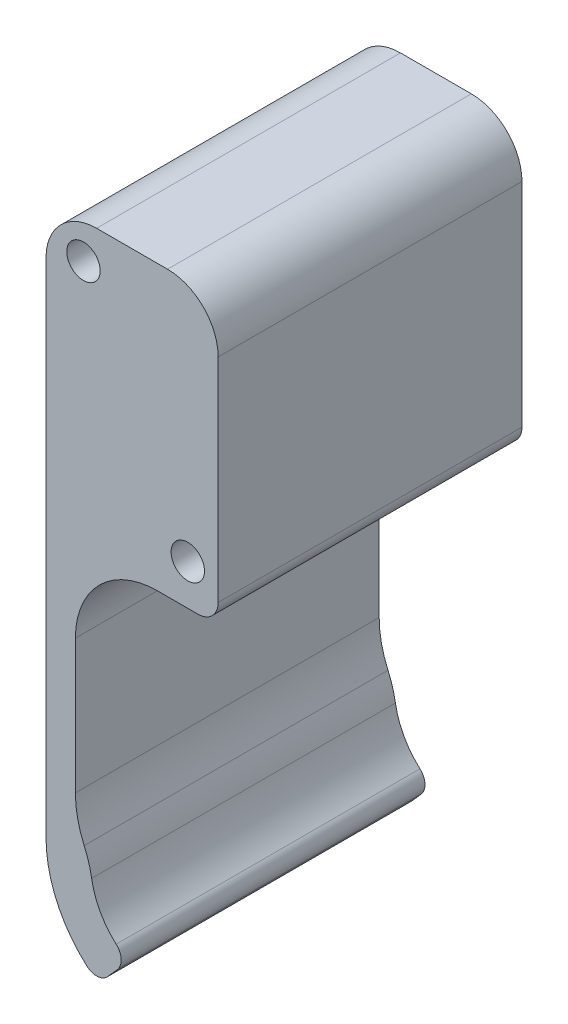
ISO-10303-21;
HEADER;
FILE_DESCRIPTION(('STEP AP214'),'2;1');
FILE_NAME('part.step','',(''),(''),'','','');
FILE_SCHEMA(('AUTOMOTIVE_DESIGN { 1 0 10303 214 1 1 1 1 }'));
ENDSEC;
DATA;
#1=APPLICATION_CONTEXT('core data for automotive mechanical design processes');
#2=APPLICATION_PROTOCOL_DEFINITION('international standard','automotive_design',2000,#1);
#3=PRODUCT_CONTEXT('',#1,'mechanical');
#4=PRODUCT('Part','Part','',(#3));
#5=PRODUCT_RELATED_PRODUCT_CATEGORY('part','',(#4));
#6=PRODUCT_DEFINITION_FORMATION('','',#4);
#7=PRODUCT_DEFINITION_CONTEXT('part definition',#1,'design');
#8=PRODUCT_DEFINITION('design','',#6,#7);
#9=PRODUCT_DEFINITION_SHAPE('','',#8);
#10=(LENGTH_UNIT() NAMED_UNIT(*) SI_UNIT(.MILLI.,.METRE.));
#11=(NAMED_UNIT(*) PLANE_ANGLE_UNIT() SI_UNIT($,.RADIAN.));
#12=(NAMED_UNIT(*) SI_UNIT($,.STERADIAN.) SOLID_ANGLE_UNIT());
#13=UNCERTAINTY_MEASURE_WITH_UNIT(LENGTH_MEASURE(1.E-05),#10,'distance_accuracy_value','');
#14=(GEOMETRIC_REPRESENTATION_CONTEXT(3) GLOBAL_UNCERTAINTY_ASSIGNED_CONTEXT((#13)) GLOBAL_UNIT_ASSIGNED_CONTEXT((#10,
#11,#12)) REPRESENTATION_CONTEXT('',''));
#15=CARTESIAN_POINT('',(0.,0.,0.));
#16=DIRECTION('',(0.,0.,1.));
#17=DIRECTION('',(1.,0.,0.));
#18=AXIS2_PLACEMENT_3D('',#15,#16,#17);
#19=CARTESIAN_POINT('',(-10.,-8.75,30.));
#20=DIRECTION('',(0.,0.,-1.));
#21=DIRECTION('',(-1.,0.,0.));
#22=AXIS2_PLACEMENT_3D('',#19,#20,#21);
#23=CYLINDRICAL_SURFACE('',#22,12.);
#24=CARTESIAN_POINT('',(-10.,-8.75,0.));
#25=DIRECTION('',(0.,0.,1.));
#26=DIRECTION('',(1.,0.,0.));
#27=AXIS2_PLACEMENT_3D('',#24,#25,#26);
#28=CIRCLE('',#27,12.);
#29=CARTESIAN_POINT('',(-22.,-8.75,0.));
#30=VERTEX_POINT('',#29);
#31=CARTESIAN_POINT('',(-17.9620853080569,-17.7280397385635,0.));
#32=VERTEX_POINT('',#31);
#33=EDGE_CURVE('E194',#30,#32,#28,.T.);
#34=ORIENTED_EDGE('',*,*,#33,.T.);
#35=DIRECTION('',(0.,0.,1.));
#36=VECTOR('',#35,1.);
#37=CARTESIAN_POINT('',(-17.9620853080569,-17.7280397385635,0.));
#38=LINE('',#37,#36);
#39=CARTESIAN_POINT('',(-17.9620853080569,-17.7280397385635,30.));
#40=VERTEX_POINT('',#39);
#41=EDGE_CURVE('E190',#32,#40,#38,.T.);
#42=ORIENTED_EDGE('',*,*,#41,.T.);
#43=CARTESIAN_POINT('',(-10.,-8.75,30.));
#44=DIRECTION('',(0.,0.,1.));
#45=DIRECTION('',(1.,0.,0.));
#46=AXIS2_PLACEMENT_3D('',#43,#44,#45);
#47=CIRCLE('',#46,12.);
#48=CARTESIAN_POINT('',(-22.,-8.75,30.));
#49=VERTEX_POINT('',#48);
#50=EDGE_CURVE('E195',#49,#40,#47,.T.);
#51=ORIENTED_EDGE('',*,*,#50,.F.);
#52=DIRECTION('',(0.,0.,-1.));
#53=VECTOR('',#52,1.);
#54=CARTESIAN_POINT('',(-22.,-8.75,30.));
#55=LINE('',#54,#53);
#56=EDGE_CURVE('E214',#49,#30,#55,.T.);
#57=ORIENTED_EDGE('',*,*,#56,.T.);
#58=EDGE_LOOP('',(#34,#42,#51,#57));
#59=FACE_BOUND('',#58,.T.);
#60=ADVANCED_FACE('F39',(#59),#23,.T.);
#61=CARTESIAN_POINT('',(-19.1,9.74999999999994,30.));
#62=DIRECTION('',(-1.,0.,0.));
#63=DIRECTION('',(0.,0.,1.));
#64=AXIS2_PLACEMENT_3D('',#61,#62,#63);
#65=PLANE('',#64);
#66=DIRECTION('',(0.,1.,0.));
#67=VECTOR('',#66,1.);
#68=CARTESIAN_POINT('',(-19.1,9.74999999999994,30.));
#69=LINE('',#68,#67);
#70=CARTESIAN_POINT('',(-19.1,-3.48217312357362,30.));
#71=VERTEX_POINT('',#70);
#72=CARTESIAN_POINT('',(-19.1,9.74999999999995,30.));
#73=VERTEX_POINT('',#72);
#74=EDGE_CURVE('E198',#71,#73,#69,.T.);
#75=ORIENTED_EDGE('',*,*,#74,.F.);
#76=DIRECTION('',(0.,0.,1.));
#77=VECTOR('',#76,1.);
#78=CARTESIAN_POINT('',(-19.1,-3.48217312357362,30.));
#79=LINE('',#78,#77);
#80=CARTESIAN_POINT('',(-19.1,-3.48217312357362,0.));
#81=VERTEX_POINT('',#80);
#82=EDGE_CURVE('E245',#71,#81,#79,.F.);
#83=ORIENTED_EDGE('',*,*,#82,.T.);
#84=DIRECTION('',(0.,1.,0.));
#85=VECTOR('',#84,1.);
#86=CARTESIAN_POINT('',(-19.1,9.74999999999994,0.));
#87=LINE('',#86,#85);
#88=CARTESIAN_POINT('',(-19.1,9.74999999999995,0.));
#89=VERTEX_POINT('',#88);
#90=EDGE_CURVE('E217',#81,#89,#87,.T.);
#91=ORIENTED_EDGE('',*,*,#90,.T.);
#92=DIRECTION('',(0.,0.,-1.));
#93=VECTOR('',#92,1.);
#94=CARTESIAN_POINT('',(-19.1,9.74999999999995,30.));
#95=LINE('',#94,#93);
#96=EDGE_CURVE('E242',#73,#89,#95,.T.);
#97=ORIENTED_EDGE('',*,*,#96,.F.);
#98=EDGE_LOOP('',(#75,#83,#91,#97));
#99=FACE_BOUND('',#98,.T.);
#100=ADVANCED_FACE('F303',(#99),#65,.F.);
#101=CARTESIAN_POINT('',(-11.,9.75,30.));
#102=DIRECTION('',(0.,0.,-1.));
#103=DIRECTION('',(-1.,0.,0.));
#104=AXIS2_PLACEMENT_3D('',#101,#102,#103);
#105=CYLINDRICAL_SURFACE('',#104,8.1);
#106=CARTESIAN_POINT('',(-11.,9.75,0.));
#107=DIRECTION('',(0.,0.,-1.));
#108=DIRECTION('',(1.,0.,0.));
#109=AXIS2_PLACEMENT_3D('',#106,#107,#108);
#110=CIRCLE('',#109,8.1);
#111=CARTESIAN_POINT('',(-10.9999999999999,17.85,0.));
#112=VERTEX_POINT('',#111);
#113=EDGE_CURVE('E219',#89,#112,#110,.T.);
#114=ORIENTED_EDGE('',*,*,#113,.T.);
#115=DIRECTION('',(0.,0.,-1.));
#116=VECTOR('',#115,1.);
#117=CARTESIAN_POINT('',(-10.9999999999999,17.85,30.));
#118=LINE('',#117,#116);
#119=CARTESIAN_POINT('',(-10.9999999999999,17.85,30.));
#120=VERTEX_POINT('',#119);
#121=EDGE_CURVE('E239',#120,#112,#118,.T.);
#122=ORIENTED_EDGE('',*,*,#121,.F.);
#123=CARTESIAN_POINT('',(-11.,9.75,30.));
#124=DIRECTION('',(0.,0.,-1.));
#125=DIRECTION('',(1.,0.,0.));
#126=AXIS2_PLACEMENT_3D('',#123,#124,#125);
#127=CIRCLE('',#126,8.1);
#128=EDGE_CURVE('E201',#73,#120,#127,.T.);
#129=ORIENTED_EDGE('',*,*,#128,.F.);
#130=ORIENTED_EDGE('',*,*,#96,.T.);
#131=EDGE_LOOP('',(#114,#122,#129,#130));
#132=FACE_BOUND('',#131,.T.);
#133=ADVANCED_FACE('F309',(#132),#105,.F.);
#134=CARTESIAN_POINT('',(-10.9999999999999,17.85,30.));
#135=DIRECTION('',(0.,1.,0.));
#136=DIRECTION('',(0.,0.,1.));
#137=AXIS2_PLACEMENT_3D('',#134,#135,#136);
#138=PLANE('',#137);
#139=DIRECTION('',(1.,0.,0.));
#140=VECTOR('',#139,1.);
#141=CARTESIAN_POINT('',(-10.9999999999999,17.85,0.));
#142=LINE('',#141,#140);
#143=CARTESIAN_POINT('',(-7.,17.85,0.));
#144=VERTEX_POINT('',#143);
#145=EDGE_CURVE('E221',#112,#144,#142,.T.);
#146=ORIENTED_EDGE('',*,*,#145,.T.);
#147=DIRECTION('',(0.,0.,-1.));
#148=VECTOR('',#147,1.);
#149=CARTESIAN_POINT('',(-7.,17.85,30.));
#150=LINE('',#149,#148);
#151=CARTESIAN_POINT('',(-7.,17.85,30.));
#152=VERTEX_POINT('',#151);
#153=EDGE_CURVE('E267',#144,#152,#150,.F.);
#154=ORIENTED_EDGE('',*,*,#153,.T.);
#155=DIRECTION('',(1.,0.,0.));
#156=VECTOR('',#155,1.);
#157=CARTESIAN_POINT('',(-10.9999999999999,17.85,30.));
#158=LINE('',#157,#156);
#159=EDGE_CURVE('E203',#120,#152,#158,.T.);
#160=ORIENTED_EDGE('',*,*,#159,.F.);
#161=ORIENTED_EDGE('',*,*,#121,.T.);
#162=EDGE_LOOP('',(#146,#154,#160,#161));
#163=FACE_BOUND('',#162,.T.);
#164=ADVANCED_FACE('F376',(#163),#138,.F.);
#165=CARTESIAN_POINT('',(-5.,17.85,30.));
#166=DIRECTION('',(-1.,0.,0.));
#167=DIRECTION('',(0.,-1.,0.));
#168=AXIS2_PLACEMENT_3D('',#165,#166,#167);
#169=PLANE('',#168);
#170=DIRECTION('',(0.,1.,0.));
#171=VECTOR('',#170,1.);
#172=CARTESIAN_POINT('',(-5.,17.85,0.));
#173=LINE('',#172,#171);
#174=CARTESIAN_POINT('',(-5.,19.85,0.));
#175=VERTEX_POINT('',#174);
#176=CARTESIAN_POINT('',(-5.,40.85,0.));
#177=VERTEX_POINT('',#176);
#178=EDGE_CURVE('E224',#175,#177,#173,.T.);
#179=ORIENTED_EDGE('',*,*,#178,.T.);
#180=DIRECTION('',(0.,0.,-1.));
#181=VECTOR('',#180,1.);
#182=CARTESIAN_POINT('',(-5.,40.85,30.));
#183=LINE('',#182,#181);
#184=CARTESIAN_POINT('',(-5.,40.85,30.));
#185=VERTEX_POINT('',#184);
#186=EDGE_CURVE('E47',#177,#185,#183,.F.);
#187=ORIENTED_EDGE('',*,*,#186,.T.);
#188=DIRECTION('',(0.,1.,0.));
#189=VECTOR('',#188,1.);
#190=CARTESIAN_POINT('',(-5.,17.85,30.));
#191=LINE('',#190,#189);
#192=CARTESIAN_POINT('',(-5.,19.85,30.));
#193=VERTEX_POINT('',#192);
#194=EDGE_CURVE('E206',#193,#185,#191,.T.);
#195=ORIENTED_EDGE('',*,*,#194,.F.);
#196=DIRECTION('',(0.,0.,-1.));
#197=VECTOR('',#196,1.);
#198=CARTESIAN_POINT('',(-5.,19.85,30.));
#199=LINE('',#198,#197);
#200=EDGE_CURVE('E262',#193,#175,#199,.T.);
#201=ORIENTED_EDGE('',*,*,#200,.T.);
#202=EDGE_LOOP('',(#179,#187,#195,#201));
#203=FACE_BOUND('',#202,.T.);
#204=ADVANCED_FACE('F373',(#203),#169,.F.);
#205=CARTESIAN_POINT('',(-17.,45.85,30.));
#206=DIRECTION('',(0.,-1.,0.));
#207=DIRECTION('',(0.,0.,-1.));
#208=AXIS2_PLACEMENT_3D('',#205,#206,#207);
#209=PLANE('',#208);
#210=DIRECTION('',(-1.,0.,0.));
#211=VECTOR('',#210,1.);
#212=CARTESIAN_POINT('',(-17.,45.85,30.));
#213=LINE('',#212,#211);
#214=CARTESIAN_POINT('',(-10.,45.85,30.));
#215=VERTEX_POINT('',#214);
#216=CARTESIAN_POINT('',(-17.,45.85,30.));
#217=VERTEX_POINT('',#216);
#218=EDGE_CURVE('E208',#215,#217,#213,.T.);
#219=ORIENTED_EDGE('',*,*,#218,.F.);
#220=DIRECTION('',(0.,0.,-1.));
#221=VECTOR('',#220,1.);
#222=CARTESIAN_POINT('',(-10.,45.85,30.));
#223=LINE('',#222,#221);
#224=CARTESIAN_POINT('',(-10.,45.85,0.));
#225=VERTEX_POINT('',#224);
#226=EDGE_CURVE('E271',#215,#225,#223,.T.);
#227=ORIENTED_EDGE('',*,*,#226,.T.);
#228=DIRECTION('',(-1.,0.,0.));
#229=VECTOR('',#228,1.);
#230=CARTESIAN_POINT('',(-17.,45.85,0.));
#231=LINE('',#230,#229);
#232=CARTESIAN_POINT('',(-17.,45.85,0.));
#233=VERTEX_POINT('',#232);
#234=EDGE_CURVE('E226',#225,#233,#231,.T.);
#235=ORIENTED_EDGE('',*,*,#234,.T.);
#236=DIRECTION('',(0.,0.,-1.));
#237=VECTOR('',#236,1.);
#238=CARTESIAN_POINT('',(-17.,45.85,30.));
#239=LINE('',#238,#237);
#240=EDGE_CURVE('E236',#217,#233,#239,.T.);
#241=ORIENTED_EDGE('',*,*,#240,.F.);
#242=EDGE_LOOP('',(#219,#227,#235,#241));
#243=FACE_BOUND('',#242,.T.);
#244=ADVANCED_FACE('F277',(#243),#209,.F.);
#245=CARTESIAN_POINT('',(-17.,40.85,30.));
#246=DIRECTION('',(0.,0.,-1.));
#247=DIRECTION('',(-1.,0.,0.));
#248=AXIS2_PLACEMENT_3D('',#245,#246,#247);
#249=CYLINDRICAL_SURFACE('',#248,5.);
#250=CARTESIAN_POINT('',(-17.,40.85,0.));
#251=DIRECTION('',(0.,0.,1.));
#252=DIRECTION('',(1.,0.,0.));
#253=AXIS2_PLACEMENT_3D('',#250,#251,#252);
#254=CIRCLE('',#253,5.);
#255=CARTESIAN_POINT('',(-22.,40.85,0.));
#256=VERTEX_POINT('',#255);
#257=EDGE_CURVE('E228',#233,#256,#254,.T.);
#258=ORIENTED_EDGE('',*,*,#257,.T.);
#259=DIRECTION('',(0.,0.,-1.));
#260=VECTOR('',#259,1.);
#261=CARTESIAN_POINT('',(-22.,40.85,30.));
#262=LINE('',#261,#260);
#263=CARTESIAN_POINT('',(-22.,40.85,30.));
#264=VERTEX_POINT('',#263);
#265=EDGE_CURVE('E233',#264,#256,#262,.T.);
#266=ORIENTED_EDGE('',*,*,#265,.F.);
#267=CARTESIAN_POINT('',(-17.,40.85,30.));
#268=DIRECTION('',(0.,0.,1.));
#269=DIRECTION('',(1.,0.,0.));
#270=AXIS2_PLACEMENT_3D('',#267,#268,#269);
#271=CIRCLE('',#270,5.);
#272=EDGE_CURVE('E210',#217,#264,#271,.T.);
#273=ORIENTED_EDGE('',*,*,#272,.F.);
#274=ORIENTED_EDGE('',*,*,#240,.T.);
#275=EDGE_LOOP('',(#258,#266,#273,#274));
#276=FACE_BOUND('',#275,.T.);
#277=ADVANCED_FACE('F286',(#276),#249,.T.);
#278=CARTESIAN_POINT('',(-22.,40.85,30.));
#279=DIRECTION('',(1.,0.,0.));
#280=DIRECTION('',(0.,0.,-1.));
#281=AXIS2_PLACEMENT_3D('',#278,#279,#280);
#282=PLANE('',#281);
#283=DIRECTION('',(0.,-1.,0.));
#284=VECTOR('',#283,1.);
#285=CARTESIAN_POINT('',(-22.,40.85,0.));
#286=LINE('',#285,#284);
#287=EDGE_CURVE('E199',#256,#30,#286,.T.);
#288=ORIENTED_EDGE('',*,*,#287,.T.);
#289=ORIENTED_EDGE('',*,*,#56,.F.);
#290=DIRECTION('',(0.,-1.,0.));
#291=VECTOR('',#290,1.);
#292=CARTESIAN_POINT('',(-22.,40.85,30.));
#293=LINE('',#292,#291);
#294=EDGE_CURVE('E212',#264,#49,#293,.T.);
#295=ORIENTED_EDGE('',*,*,#294,.F.);
#296=ORIENTED_EDGE('',*,*,#265,.T.);
#297=EDGE_LOOP('',(#288,#289,#295,#296));
#298=FACE_BOUND('',#297,.T.);
#299=ADVANCED_FACE('F290',(#298),#282,.F.);
#300=CARTESIAN_POINT('',(-10.,-8.75,30.));
#301=DIRECTION('',(0.,0.,1.));
#302=DIRECTION('',(1.,0.,0.));
#303=AXIS2_PLACEMENT_3D('',#300,#301,#302);
#304=PLANE('',#303);
#305=CARTESIAN_POINT('',(-8.,21.85,30.));
#306=DIRECTION('',(0.,0.,1.));
#307=DIRECTION('',(1.,0.,0.));
#308=AXIS2_PLACEMENT_3D('',#305,#306,#307);
#309=CIRCLE('',#308,1.65);
#310=CARTESIAN_POINT('',(-6.35,21.85,30.));
#311=VERTEX_POINT('',#310);
#312=EDGE_CURVE('E341',#311,#311,#309,.T.);
#313=ORIENTED_EDGE('',*,*,#312,.F.);
#314=EDGE_LOOP('',(#313));
#315=FACE_BOUND('',#314,.T.);
#316=CARTESIAN_POINT('',(-18.3013742886583,42.3822961817113,30.));
#317=DIRECTION('',(0.,0.,1.));
#318=DIRECTION('',(1.,0.,0.));
#319=AXIS2_PLACEMENT_3D('',#316,#317,#318);
#320=CIRCLE('',#319,1.65);
#321=CARTESIAN_POINT('',(-16.6513742886583,42.3822961817113,30.));
#322=VERTEX_POINT('',#321);
#323=EDGE_CURVE('E338',#322,#322,#320,.T.);
#324=ORIENTED_EDGE('',*,*,#323,.F.);
#325=EDGE_LOOP('',(#324));
#326=FACE_BOUND('',#325,.T.);
#327=ORIENTED_EDGE('',*,*,#194,.T.);
#328=CARTESIAN_POINT('',(-10.,40.85,30.));
#329=DIRECTION('',(0.,0.,1.));
#330=DIRECTION('',(1.,0.,0.));
#331=AXIS2_PLACEMENT_3D('',#328,#329,#330);
#332=CIRCLE('',#331,5.);
#333=EDGE_CURVE('E11',#185,#215,#332,.T.);
#334=ORIENTED_EDGE('',*,*,#333,.T.);
#335=ORIENTED_EDGE('',*,*,#218,.T.);
#336=ORIENTED_EDGE('',*,*,#272,.T.);
#337=ORIENTED_EDGE('',*,*,#294,.T.);
#338=ORIENTED_EDGE('',*,*,#50,.T.);
#339=CARTESIAN_POINT('',(-17.,-16.6431932701537,30.));
#340=DIRECTION('',(0.,0.,-1.));
#341=DIRECTION('',(1.,0.,0.));
#342=AXIS2_PLACEMENT_3D('',#339,#340,#341);
#343=CIRCLE('',#342,1.45);
#344=CARTESIAN_POINT('',(-15.9151535315903,-17.6052785782106,30.));
#345=VERTEX_POINT('',#344);
#346=EDGE_CURVE('E186',#345,#40,#343,.T.);
#347=ORIENTED_EDGE('',*,*,#346,.F.);
#348=DIRECTION('',(0.66350710900474,0.748169978213622,0.));
#349=VECTOR('',#348,1.);
#350=CARTESIAN_POINT('',(-15.9151535315903,-17.6052785782106,30.));
#351=LINE('',#350,#349);
#352=CARTESIAN_POINT('',(-14.9529770817591,-16.5203293384238,30.));
#353=VERTEX_POINT('',#352);
#354=EDGE_CURVE('E182',#345,#353,#351,.T.);
#355=ORIENTED_EDGE('',*,*,#354,.T.);
#356=CARTESIAN_POINT('',(-16.0752320490795,-15.5250686749167,30.));
#357=DIRECTION('',(0.,0.,1.));
#358=DIRECTION('',(1.,0.,0.));
#359=AXIS2_PLACEMENT_3D('',#356,#357,#358);
#360=CIRCLE('',#359,1.5);
#361=CARTESIAN_POINT('',(-15.0738201728576,-14.4082991131172,30.));
#362=VERTEX_POINT('',#361);
#363=EDGE_CURVE('E158',#353,#362,#360,.T.);
#364=ORIENTED_EDGE('',*,*,#363,.T.);
#365=CARTESIAN_POINT('',(-10.,-8.75,30.));
#366=DIRECTION('',(0.,0.,-1.));
#367=DIRECTION('',(1.,0.,0.));
#368=AXIS2_PLACEMENT_3D('',#365,#366,#367);
#369=CIRCLE('',#368,7.6);
#370=CARTESIAN_POINT('',(-17.49696650299,-9.99719415210522,30.));
#371=VERTEX_POINT('',#370);
#372=EDGE_CURVE('E179',#362,#371,#369,.T.);
#373=ORIENTED_EDGE('',*,*,#372,.T.);
#374=CARTESIAN_POINT('',(-27.3613961121874,-11.6382390890858,30.));
#375=DIRECTION('',(0.,0.,1.));
#376=DIRECTION('',(1.,0.,0.));
#377=AXIS2_PLACEMENT_3D('',#374,#375,#376);
#378=CIRCLE('',#377,10.);
#379=CARTESIAN_POINT('',(-18.2306980560937,-7.5602061063297,30.));
#380=VERTEX_POINT('',#379);
#381=EDGE_CURVE('E256',#371,#380,#378,.T.);
#382=ORIENTED_EDGE('',*,*,#381,.T.);
#383=CARTESIAN_POINT('',(-9.1,-3.48217312357362,30.));
#384=DIRECTION('',(0.,0.,1.));
#385=DIRECTION('',(1.,0.,0.));
#386=AXIS2_PLACEMENT_3D('',#383,#384,#385);
#387=CIRCLE('',#386,10.);
#388=EDGE_CURVE('E251',#380,#71,#387,.F.);
#389=ORIENTED_EDGE('',*,*,#388,.T.);
#390=ORIENTED_EDGE('',*,*,#74,.T.);
#391=ORIENTED_EDGE('',*,*,#128,.T.);
#392=ORIENTED_EDGE('',*,*,#159,.T.);
#393=CARTESIAN_POINT('',(-7.,19.85,30.));
#394=DIRECTION('',(0.,0.,1.));
#395=DIRECTION('',(1.,0.,0.));
#396=AXIS2_PLACEMENT_3D('',#393,#394,#395);
#397=CIRCLE('',#396,2.);
#398=EDGE_CURVE('E269',#152,#193,#397,.T.);
#399=ORIENTED_EDGE('',*,*,#398,.T.);
#400=EDGE_LOOP('',(#327,#334,#335,#336,#337,#338,#347,#355,#364,#373,#382,#389,#390,#391,#392,#399));
#401=FACE_BOUND('',#400,.T.);
#402=ADVANCED_FACE('F294',(#315,#326,#401),#304,.T.);
#403=CARTESIAN_POINT('',(-10.,-8.75,0.));
#404=DIRECTION('',(0.,0.,1.));
#405=DIRECTION('',(1.,0.,0.));
#406=AXIS2_PLACEMENT_3D('',#403,#404,#405);
#407=PLANE('',#406);
#408=CARTESIAN_POINT('',(-8.,21.85,0.));
#409=DIRECTION('',(0.,0.,1.));
#410=DIRECTION('',(1.,0.,0.));
#411=AXIS2_PLACEMENT_3D('',#408,#409,#410);
#412=CIRCLE('',#411,1.65);
#413=CARTESIAN_POINT('',(-6.35,21.85,0.));
#414=VERTEX_POINT('',#413);
#415=EDGE_CURVE('E183',#414,#414,#412,.T.);
#416=ORIENTED_EDGE('',*,*,#415,.T.);
#417=EDGE_LOOP('',(#416));
#418=FACE_BOUND('',#417,.T.);
#419=CARTESIAN_POINT('',(-18.3013742886583,42.3822961817113,0.));
#420=DIRECTION('',(0.,0.,1.));
#421=DIRECTION('',(1.,0.,0.));
#422=AXIS2_PLACEMENT_3D('',#419,#420,#421);
#423=CIRCLE('',#422,1.65);
#424=CARTESIAN_POINT('',(-16.6513742886583,42.3822961817113,0.));
#425=VERTEX_POINT('',#424);
#426=EDGE_CURVE('E335',#425,#425,#423,.T.);
#427=ORIENTED_EDGE('',*,*,#426,.T.);
#428=EDGE_LOOP('',(#427));
#429=FACE_BOUND('',#428,.T.);
#430=ORIENTED_EDGE('',*,*,#234,.F.);
#431=CARTESIAN_POINT('',(-10.,40.85,0.));
#432=DIRECTION('',(0.,0.,1.));
#433=DIRECTION('',(1.,0.,0.));
#434=AXIS2_PLACEMENT_3D('',#431,#432,#433);
#435=CIRCLE('',#434,5.);
#436=EDGE_CURVE('E61',#225,#177,#435,.F.);
#437=ORIENTED_EDGE('',*,*,#436,.T.);
#438=ORIENTED_EDGE('',*,*,#178,.F.);
#439=CARTESIAN_POINT('',(-7.,19.85,0.));
#440=DIRECTION('',(0.,0.,1.));
#441=DIRECTION('',(1.,0.,0.));
#442=AXIS2_PLACEMENT_3D('',#439,#440,#441);
#443=CIRCLE('',#442,2.);
#444=EDGE_CURVE('E265',#175,#144,#443,.F.);
#445=ORIENTED_EDGE('',*,*,#444,.T.);
#446=ORIENTED_EDGE('',*,*,#145,.F.);
#447=ORIENTED_EDGE('',*,*,#113,.F.);
#448=ORIENTED_EDGE('',*,*,#90,.F.);
#449=CARTESIAN_POINT('',(-9.1,-3.48217312357362,0.));
#450=DIRECTION('',(0.,0.,1.));
#451=DIRECTION('',(1.,0.,0.));
#452=AXIS2_PLACEMENT_3D('',#449,#450,#451);
#453=CIRCLE('',#452,10.);
#454=CARTESIAN_POINT('',(-18.2306980560937,-7.5602061063297,0.));
#455=VERTEX_POINT('',#454);
#456=EDGE_CURVE('E248',#81,#455,#453,.T.);
#457=ORIENTED_EDGE('',*,*,#456,.T.);
#458=CARTESIAN_POINT('',(-27.3613961121874,-11.6382390890858,0.));
#459=DIRECTION('',(0.,0.,1.));
#460=DIRECTION('',(1.,0.,0.));
#461=AXIS2_PLACEMENT_3D('',#458,#459,#460);
#462=CIRCLE('',#461,10.);
#463=CARTESIAN_POINT('',(-17.49696650299,-9.99719415210522,0.));
#464=VERTEX_POINT('',#463);
#465=EDGE_CURVE('E260',#455,#464,#462,.F.);
#466=ORIENTED_EDGE('',*,*,#465,.T.);
#467=CARTESIAN_POINT('',(-10.,-8.75,0.));
#468=DIRECTION('',(0.,0.,-1.));
#469=DIRECTION('',(1.,0.,0.));
#470=AXIS2_PLACEMENT_3D('',#467,#468,#469);
#471=CIRCLE('',#470,7.6);
#472=CARTESIAN_POINT('',(-15.0738201728576,-14.4082991131172,0.));
#473=VERTEX_POINT('',#472);
#474=EDGE_CURVE('E170',#473,#464,#471,.T.);
#475=ORIENTED_EDGE('',*,*,#474,.F.);
#476=CARTESIAN_POINT('',(-16.0752320490795,-15.5250686749167,0.));
#477=DIRECTION('',(0.,0.,1.));
#478=DIRECTION('',(1.,0.,0.));
#479=AXIS2_PLACEMENT_3D('',#476,#477,#478);
#480=CIRCLE('',#479,1.5);
#481=CARTESIAN_POINT('',(-14.9529770817591,-16.5203293384238,0.));
#482=VERTEX_POINT('',#481);
#483=EDGE_CURVE('E156',#482,#473,#480,.T.);
#484=ORIENTED_EDGE('',*,*,#483,.F.);
#485=DIRECTION('',(0.66350710900474,0.748169978213622,0.));
#486=VECTOR('',#485,1.);
#487=CARTESIAN_POINT('',(-15.9151535315903,-17.6052785782106,0.));
#488=LINE('',#487,#486);
#489=CARTESIAN_POINT('',(-15.9151535315903,-17.6052785782106,0.));
#490=VERTEX_POINT('',#489);
#491=EDGE_CURVE('E167',#490,#482,#488,.T.);
#492=ORIENTED_EDGE('',*,*,#491,.F.);
#493=CARTESIAN_POINT('',(-17.,-16.6431932701537,0.));
#494=DIRECTION('',(0.,0.,-1.));
#495=DIRECTION('',(1.,0.,0.));
#496=AXIS2_PLACEMENT_3D('',#493,#494,#495);
#497=CIRCLE('',#496,1.45);
#498=EDGE_CURVE('E188',#490,#32,#497,.T.);
#499=ORIENTED_EDGE('',*,*,#498,.T.);
#500=ORIENTED_EDGE('',*,*,#33,.F.);
#501=ORIENTED_EDGE('',*,*,#287,.F.);
#502=ORIENTED_EDGE('',*,*,#257,.F.);
#503=EDGE_LOOP('',(#430,#437,#438,#445,#446,#447,#448,#457,#466,#475,#484,#492,#499,#500,#501,#502));
#504=FACE_BOUND('',#503,.T.);
#505=ADVANCED_FACE('F173',(#418,#429,#504),#407,.F.);
#506=CARTESIAN_POINT('',(-17.,-16.6431932701537,0.));
#507=DIRECTION('',(0.,0.,1.));
#508=DIRECTION('',(1.,0.,0.));
#509=AXIS2_PLACEMENT_3D('',#506,#507,#508);
#510=CYLINDRICAL_SURFACE('',#509,1.45);
#511=ORIENTED_EDGE('',*,*,#498,.F.);
#512=DIRECTION('',(0.,0.,1.));
#513=VECTOR('',#512,1.);
#514=CARTESIAN_POINT('',(-15.9151535315903,-17.6052785782106,0.));
#515=LINE('',#514,#513);
#516=EDGE_CURVE('E163',#490,#345,#515,.T.);
#517=ORIENTED_EDGE('',*,*,#516,.T.);
#518=ORIENTED_EDGE('',*,*,#346,.T.);
#519=ORIENTED_EDGE('',*,*,#41,.F.);
#520=EDGE_LOOP('',(#511,#517,#518,#519));
#521=FACE_BOUND('',#520,.T.);
#522=ADVANCED_FACE('F363',(#521),#510,.T.);
#523=CARTESIAN_POINT('',(-10.,-8.75,0.));
#524=DIRECTION('',(0.,0.,1.));
#525=DIRECTION('',(1.,0.,0.));
#526=AXIS2_PLACEMENT_3D('',#523,#524,#525);
#527=CYLINDRICAL_SURFACE('',#526,7.6);
#528=ORIENTED_EDGE('',*,*,#474,.T.);
#529=DIRECTION('',(0.,0.,1.));
#530=VECTOR('',#529,1.);
#531=CARTESIAN_POINT('',(-17.49696650299,-9.99719415210522,0.));
#532=LINE('',#531,#530);
#533=EDGE_CURVE('E253',#464,#371,#532,.T.);
#534=ORIENTED_EDGE('',*,*,#533,.T.);
#535=ORIENTED_EDGE('',*,*,#372,.F.);
#536=DIRECTION('',(0.,0.,1.));
#537=VECTOR('',#536,1.);
#538=CARTESIAN_POINT('',(-15.0738201728576,-14.4082991131172,0.));
#539=LINE('',#538,#537);
#540=EDGE_CURVE('E162',#473,#362,#539,.T.);
#541=ORIENTED_EDGE('',*,*,#540,.F.);
#542=EDGE_LOOP('',(#528,#534,#535,#541));
#543=FACE_BOUND('',#542,.T.);
#544=ADVANCED_FACE('F332',(#543),#527,.F.);
#545=CARTESIAN_POINT('',(-16.0752320490795,-15.5250686749167,0.));
#546=DIRECTION('',(0.,0.,1.));
#547=DIRECTION('',(1.,0.,0.));
#548=AXIS2_PLACEMENT_3D('',#545,#546,#547);
#549=CYLINDRICAL_SURFACE('',#548,1.5);
#550=ORIENTED_EDGE('',*,*,#363,.F.);
#551=DIRECTION('',(0.,0.,1.));
#552=VECTOR('',#551,1.);
#553=CARTESIAN_POINT('',(-14.9529770817591,-16.5203293384238,0.));
#554=LINE('',#553,#552);
#555=EDGE_CURVE('E152',#482,#353,#554,.T.);
#556=ORIENTED_EDGE('',*,*,#555,.F.);
#557=ORIENTED_EDGE('',*,*,#483,.T.);
#558=ORIENTED_EDGE('',*,*,#540,.T.);
#559=EDGE_LOOP('',(#550,#556,#557,#558));
#560=FACE_BOUND('',#559,.T.);
#561=ADVANCED_FACE('F154',(#560),#549,.T.);
#562=CARTESIAN_POINT('',(-15.9151535315903,-17.6052785782106,0.));
#563=DIRECTION('',(0.748169978213622,-0.66350710900474,0.));
#564=DIRECTION('',(0.66350710900474,0.748169978213622,0.));
#565=AXIS2_PLACEMENT_3D('',#562,#563,#564);
#566=PLANE('',#565);
#567=ORIENTED_EDGE('',*,*,#354,.F.);
#568=ORIENTED_EDGE('',*,*,#516,.F.);
#569=ORIENTED_EDGE('',*,*,#491,.T.);
#570=ORIENTED_EDGE('',*,*,#555,.T.);
#571=EDGE_LOOP('',(#567,#568,#569,#570));
#572=FACE_BOUND('',#571,.T.);
#573=ADVANCED_FACE('F168',(#572),#566,.T.);
#574=CARTESIAN_POINT('',(-9.1,-3.48217312357362,0.));
#575=DIRECTION('',(0.,0.,1.));
#576=DIRECTION('',(1.,0.,0.));
#577=AXIS2_PLACEMENT_3D('',#574,#575,#576);
#578=CYLINDRICAL_SURFACE('',#577,10.);
#579=ORIENTED_EDGE('',*,*,#388,.F.);
#580=DIRECTION('',(0.,0.,1.));
#581=VECTOR('',#580,1.);
#582=CARTESIAN_POINT('',(-18.2306980560937,-7.5602061063297,0.));
#583=LINE('',#582,#581);
#584=EDGE_CURVE('E258',#380,#455,#583,.F.);
#585=ORIENTED_EDGE('',*,*,#584,.T.);
#586=ORIENTED_EDGE('',*,*,#456,.F.);
#587=ORIENTED_EDGE('',*,*,#82,.F.);
#588=EDGE_LOOP('',(#579,#585,#586,#587));
#589=FACE_BOUND('',#588,.T.);
#590=ADVANCED_FACE('F314',(#589),#578,.F.);
#591=CARTESIAN_POINT('',(-27.3613961121874,-11.6382390890858,0.));
#592=DIRECTION('',(0.,0.,1.));
#593=DIRECTION('',(1.,0.,0.));
#594=AXIS2_PLACEMENT_3D('',#591,#592,#593);
#595=CYLINDRICAL_SURFACE('',#594,10.);
#596=ORIENTED_EDGE('',*,*,#465,.F.);
#597=ORIENTED_EDGE('',*,*,#584,.F.);
#598=ORIENTED_EDGE('',*,*,#381,.F.);
#599=ORIENTED_EDGE('',*,*,#533,.F.);
#600=EDGE_LOOP('',(#596,#597,#598,#599));
#601=FACE_BOUND('',#600,.T.);
#602=ADVANCED_FACE('F317',(#601),#595,.T.);
#603=CARTESIAN_POINT('',(-18.3013742886583,42.3822961817113,0.));
#604=DIRECTION('',(0.,0.,1.));
#605=DIRECTION('',(1.,0.,0.));
#606=AXIS2_PLACEMENT_3D('',#603,#604,#605);
#607=CYLINDRICAL_SURFACE('',#606,1.65);
#608=ORIENTED_EDGE('',*,*,#426,.F.);
#609=EDGE_LOOP('',(#608));
#610=FACE_BOUND('',#609,.T.);
#611=ORIENTED_EDGE('',*,*,#323,.T.);
#612=EDGE_LOOP('',(#611));
#613=FACE_BOUND('',#612,.T.);
#614=ADVANCED_FACE('F320',(#610,#613),#607,.F.);
#615=CARTESIAN_POINT('',(-8.,21.85,0.));
#616=DIRECTION('',(0.,0.,1.));
#617=DIRECTION('',(1.,0.,0.));
#618=AXIS2_PLACEMENT_3D('',#615,#616,#617);
#619=CYLINDRICAL_SURFACE('',#618,1.65);
#620=ORIENTED_EDGE('',*,*,#415,.F.);
#621=EDGE_LOOP('',(#620));
#622=FACE_BOUND('',#621,.T.);
#623=ORIENTED_EDGE('',*,*,#312,.T.);
#624=EDGE_LOOP('',(#623));
#625=FACE_BOUND('',#624,.T.);
#626=ADVANCED_FACE('F300',(#622,#625),#619,.F.);
#627=CARTESIAN_POINT('',(-7.,19.85,30.));
#628=DIRECTION('',(0.,0.,-1.));
#629=DIRECTION('',(-1.,0.,0.));
#630=AXIS2_PLACEMENT_3D('',#627,#628,#629);
#631=CYLINDRICAL_SURFACE('',#630,2.);
#632=ORIENTED_EDGE('',*,*,#398,.F.);
#633=ORIENTED_EDGE('',*,*,#153,.F.);
#634=ORIENTED_EDGE('',*,*,#444,.F.);
#635=ORIENTED_EDGE('',*,*,#200,.F.);
#636=EDGE_LOOP('',(#632,#633,#634,#635));
#637=FACE_BOUND('',#636,.T.);
#638=ADVANCED_FACE('F296',(#637),#631,.T.);
#639=CARTESIAN_POINT('',(-10.,40.85,30.));
#640=DIRECTION('',(0.,0.,-1.));
#641=DIRECTION('',(-1.,0.,0.));
#642=AXIS2_PLACEMENT_3D('',#639,#640,#641);
#643=CYLINDRICAL_SURFACE('',#642,5.);
#644=ORIENTED_EDGE('',*,*,#333,.F.);
#645=ORIENTED_EDGE('',*,*,#186,.F.);
#646=ORIENTED_EDGE('',*,*,#436,.F.);
#647=ORIENTED_EDGE('',*,*,#226,.F.);
#648=EDGE_LOOP('',(#644,#645,#646,#647));
#649=FACE_BOUND('',#648,.T.);
#650=ADVANCED_FACE('F41',(#649),#643,.T.);
#651=CLOSED_SHELL('',(#60,#100,#133,#164,#204,#244,#277,#299,#402,#505,#522,#544,#561,#573,#590,
#602,#614,#626,#638,#650));
#652=MANIFOLD_SOLID_BREP('B2',#651);
#653=ADVANCED_BREP_SHAPE_REPRESENTATION('',(#18,#652),#14);
#654=SHAPE_DEFINITION_REPRESENTATION(#9,#653);
ENDSEC;
END-ISO-10303-21;
